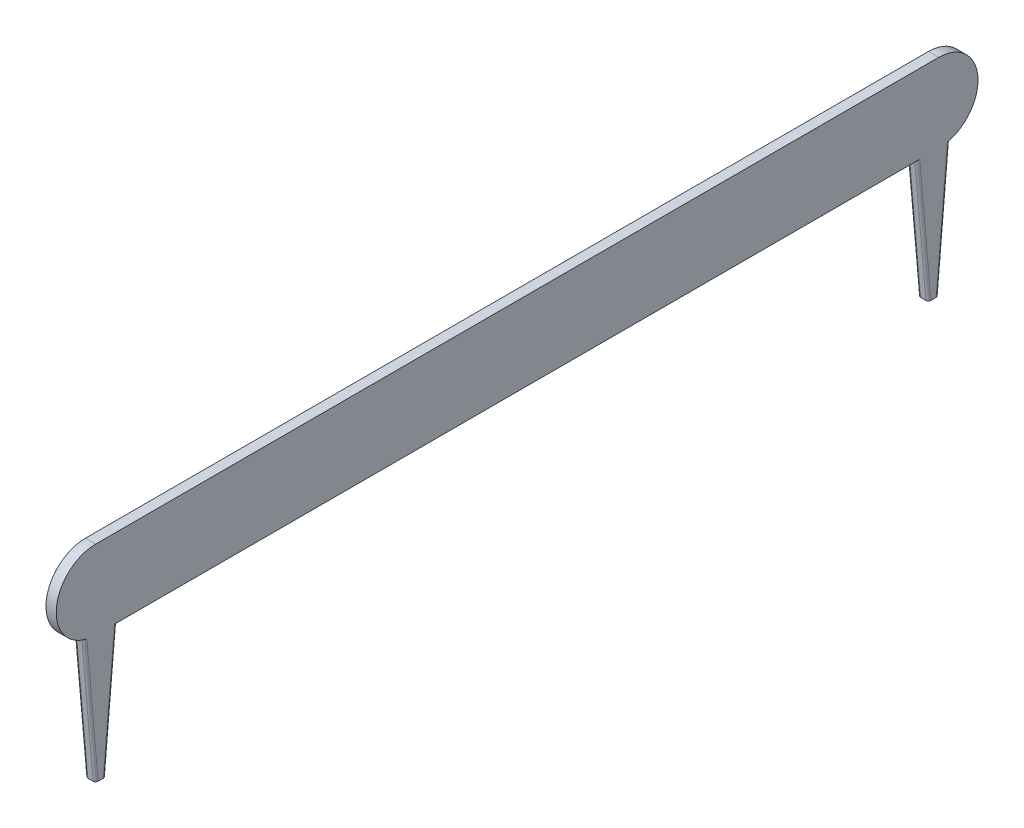
ISO-10303-21;
HEADER;
FILE_DESCRIPTION(('STEP AP214'),'2;1');
FILE_NAME('part.step','',(''),(''),'','','');
FILE_SCHEMA(('AUTOMOTIVE_DESIGN { 1 0 10303 214 1 1 1 1 }'));
ENDSEC;
DATA;
#1=APPLICATION_CONTEXT('core data for automotive mechanical design processes');
#2=APPLICATION_PROTOCOL_DEFINITION('international standard','automotive_design',2000,#1);
#3=PRODUCT_CONTEXT('',#1,'mechanical');
#4=PRODUCT('Part','Part','',(#3));
#5=PRODUCT_RELATED_PRODUCT_CATEGORY('part','',(#4));
#6=PRODUCT_DEFINITION_FORMATION('','',#4);
#7=PRODUCT_DEFINITION_CONTEXT('part definition',#1,'design');
#8=PRODUCT_DEFINITION('design','',#6,#7);
#9=PRODUCT_DEFINITION_SHAPE('','',#8);
#10=(LENGTH_UNIT() NAMED_UNIT(*) SI_UNIT(.MILLI.,.METRE.));
#11=(NAMED_UNIT(*) PLANE_ANGLE_UNIT() SI_UNIT($,.RADIAN.));
#12=(NAMED_UNIT(*) SI_UNIT($,.STERADIAN.) SOLID_ANGLE_UNIT());
#13=UNCERTAINTY_MEASURE_WITH_UNIT(LENGTH_MEASURE(1.E-05),#10,'distance_accuracy_value','');
#14=(GEOMETRIC_REPRESENTATION_CONTEXT(3) GLOBAL_UNCERTAINTY_ASSIGNED_CONTEXT((#13)) GLOBAL_UNIT_ASSIGNED_CONTEXT((#10,
#11,#12)) REPRESENTATION_CONTEXT('',''));
#15=CARTESIAN_POINT('',(0.,0.,0.));
#16=DIRECTION('',(0.,0.,1.));
#17=DIRECTION('',(1.,0.,0.));
#18=AXIS2_PLACEMENT_3D('',#15,#16,#17);
#19=CARTESIAN_POINT('',(20.,-50.000000000146,824.174999999995));
#20=DIRECTION('',(0.,1.,0.));
#21=DIRECTION('',(0.,0.,1.));
#22=AXIS2_PLACEMENT_3D('',#19,#20,#21);
#23=PLANE('',#22);
#24=DIRECTION('',(0.,0.,-1.));
#25=VECTOR('',#24,1.);
#26=CARTESIAN_POINT('',(0.,-50.000000000146,824.174999999995));
#27=LINE('',#26,#25);
#28=CARTESIAN_POINT('',(0.,-50.000000000146,787.32193330623));
#29=VERTEX_POINT('',#28);
#30=CARTESIAN_POINT('',(0.,-50.0000000001459,-787.321933306231));
#31=VERTEX_POINT('',#30);
#32=EDGE_CURVE('E203',#29,#31,#27,.T.);
#33=ORIENTED_EDGE('',*,*,#32,.T.);
#34=CARTESIAN_POINT('',(5.,-50.000000000146,-787.32193330623));
#35=DIRECTION('',(0.,1.,0.));
#36=DIRECTION('',(0.,0.,1.));
#37=AXIS2_PLACEMENT_3D('',#34,#35,#36);
#38=ELLIPSE('',#37,5.01909918771674,5.);
#39=CARTESIAN_POINT('',(5.,-50.0000000001459,-782.302834118514));
#40=VERTEX_POINT('',#39);
#41=EDGE_CURVE('E363',#31,#40,#38,.T.);
#42=ORIENTED_EDGE('',*,*,#41,.T.);
#43=DIRECTION('',(1.,0.,0.));
#44=VECTOR('',#43,1.);
#45=CARTESIAN_POINT('',(20.,-50.0000000001459,-782.302834118514));
#46=LINE('',#45,#44);
#47=CARTESIAN_POINT('',(15.,-50.0000000001459,-782.302834118514));
#48=VERTEX_POINT('',#47);
#49=EDGE_CURVE('E321',#40,#48,#46,.T.);
#50=ORIENTED_EDGE('',*,*,#49,.T.);
#51=CARTESIAN_POINT('',(15.,-50.0000000001459,-787.32193330623));
#52=DIRECTION('',(0.,1.,0.));
#53=DIRECTION('',(0.,0.,-1.));
#54=AXIS2_PLACEMENT_3D('',#51,#52,#53);
#55=ELLIPSE('',#54,5.01909918771674,5.);
#56=CARTESIAN_POINT('',(20.,-50.000000000146,-787.32193330623));
#57=VERTEX_POINT('',#56);
#58=EDGE_CURVE('E60',#48,#57,#55,.T.);
#59=ORIENTED_EDGE('',*,*,#58,.T.);
#60=DIRECTION('',(0.,0.,-1.));
#61=VECTOR('',#60,1.);
#62=CARTESIAN_POINT('',(20.,-50.000000000146,824.174999999995));
#63=LINE('',#62,#61);
#64=CARTESIAN_POINT('',(20.,-50.000000000146,787.321933306231));
#65=VERTEX_POINT('',#64);
#66=EDGE_CURVE('E67',#65,#57,#63,.T.);
#67=ORIENTED_EDGE('',*,*,#66,.F.);
#68=CARTESIAN_POINT('',(15.,-50.000000000146,787.321933306231));
#69=DIRECTION('',(0.,1.,0.));
#70=DIRECTION('',(0.,0.,1.));
#71=AXIS2_PLACEMENT_3D('',#68,#69,#70);
#72=ELLIPSE('',#71,5.01909918771674,5.);
#73=CARTESIAN_POINT('',(15.,-50.000000000146,782.302834118514));
#74=VERTEX_POINT('',#73);
#75=EDGE_CURVE('E284',#65,#74,#72,.T.);
#76=ORIENTED_EDGE('',*,*,#75,.T.);
#77=DIRECTION('',(-1.,0.,0.));
#78=VECTOR('',#77,1.);
#79=CARTESIAN_POINT('',(20.,-50.000000000146,782.302834118514));
#80=LINE('',#79,#78);
#81=CARTESIAN_POINT('',(5.,-50.000000000146,782.302834118514));
#82=VERTEX_POINT('',#81);
#83=EDGE_CURVE('E227',#82,#74,#80,.F.);
#84=ORIENTED_EDGE('',*,*,#83,.F.);
#85=CARTESIAN_POINT('',(5.,-50.0000000001459,787.32193330623));
#86=DIRECTION('',(0.,1.,0.));
#87=DIRECTION('',(0.,0.,-1.));
#88=AXIS2_PLACEMENT_3D('',#85,#86,#87);
#89=ELLIPSE('',#88,5.01909918771674,5.);
#90=EDGE_CURVE('E271',#82,#29,#89,.T.);
#91=ORIENTED_EDGE('',*,*,#90,.T.);
#92=EDGE_LOOP('',(#33,#42,#50,#59,#67,#76,#84,#91));
#93=FACE_BOUND('',#92,.T.);
#94=ADVANCED_FACE('F45',(#93),#23,.F.);
#95=CARTESIAN_POINT('',(20.,103.999999999854,824.174999999995));
#96=DIRECTION('',(0.,1.,0.));
#97=DIRECTION('',(0.,0.,1.));
#98=AXIS2_PLACEMENT_3D('',#95,#96,#97);
#99=PLANE('',#98);
#100=DIRECTION('',(0.,0.,-1.));
#101=VECTOR('',#100,1.);
#102=CARTESIAN_POINT('',(0.,103.999999999854,824.174999999995));
#103=LINE('',#102,#101);
#104=CARTESIAN_POINT('',(0.,103.999999999854,824.174999999995));
#105=VERTEX_POINT('',#104);
#106=CARTESIAN_POINT('',(0.,103.999999999854,-824.175000000005));
#107=VERTEX_POINT('',#106);
#108=EDGE_CURVE('E213',#105,#107,#103,.T.);
#109=ORIENTED_EDGE('',*,*,#108,.F.);
#110=DIRECTION('',(-1.,0.,0.));
#111=VECTOR('',#110,1.);
#112=CARTESIAN_POINT('',(20.,103.999999999854,824.174999999995));
#113=LINE('',#112,#111);
#114=CARTESIAN_POINT('',(20.,103.999999999854,824.174999999995));
#115=VERTEX_POINT('',#114);
#116=EDGE_CURVE('E196',#115,#105,#113,.T.);
#117=ORIENTED_EDGE('',*,*,#116,.F.);
#118=DIRECTION('',(0.,0.,-1.));
#119=VECTOR('',#118,1.);
#120=CARTESIAN_POINT('',(20.,103.999999999854,824.174999999995));
#121=LINE('',#120,#119);
#122=CARTESIAN_POINT('',(20.,103.999999999854,-824.175000000005));
#123=VERTEX_POINT('',#122);
#124=EDGE_CURVE('E189',#115,#123,#121,.T.);
#125=ORIENTED_EDGE('',*,*,#124,.T.);
#126=DIRECTION('',(-1.,0.,0.));
#127=VECTOR('',#126,1.);
#128=CARTESIAN_POINT('',(20.,103.999999999854,-824.175000000005));
#129=LINE('',#128,#127);
#130=EDGE_CURVE('E174',#123,#107,#129,.T.);
#131=ORIENTED_EDGE('',*,*,#130,.T.);
#132=EDGE_LOOP('',(#109,#117,#125,#131));
#133=FACE_BOUND('',#132,.T.);
#134=ADVANCED_FACE('F195',(#133),#99,.T.);
#135=CARTESIAN_POINT('',(20.,26.9999999998541,824.174999999995));
#136=DIRECTION('',(-1.,0.,0.));
#137=DIRECTION('',(0.,0.,1.));
#138=AXIS2_PLACEMENT_3D('',#135,#136,#137);
#139=CYLINDRICAL_SURFACE('',#138,77.);
#140=CARTESIAN_POINT('',(0.,26.9999999998541,824.174999999995));
#141=DIRECTION('',(1.,0.,0.));
#142=DIRECTION('',(0.,0.,-1.));
#143=AXIS2_PLACEMENT_3D('',#140,#141,#142);
#144=CIRCLE('',#143,77.);
#145=CARTESIAN_POINT('',(0.,-48.0954733114666,841.194691188402));
#146=VERTEX_POINT('',#145);
#147=EDGE_CURVE('E199',#105,#146,#144,.T.);
#148=ORIENTED_EDGE('',*,*,#147,.T.);
#149=CARTESIAN_POINT('',(0.,-48.0954733114666,841.194691188402));
#150=CARTESIAN_POINT('',(-1.0756041302022E-05,-48.0611743471263,841.346048623295));
#151=CARTESIAN_POINT('',(0.00655216893659473,-48.0264102694343,841.497293970125));
#152=CARTESIAN_POINT('',(0.0326687980328218,-47.9562273410992,841.798498559076));
#153=CARTESIAN_POINT('',(0.0522218452050827,-47.9208085236561,841.948457865847));
#154=CARTESIAN_POINT('',(0.104169423198406,-47.849578094612,842.246085545009));
#155=CARTESIAN_POINT('',(0.136567540828475,-47.8137663760168,842.393753265526));
#156=CARTESIAN_POINT('',(0.213977769658536,-47.7420608447139,842.685724601845));
#157=CARTESIAN_POINT('',(0.258989865638274,-47.7061670321053,842.830028221704));
#158=CARTESIAN_POINT('',(0.361367909285878,-47.6346060247687,843.114299846069));
#159=CARTESIAN_POINT('',(0.418737835787472,-47.5989389068459,843.254266437546));
#160=CARTESIAN_POINT('',(0.545512070701962,-47.5281721309134,843.528854091776));
#161=CARTESIAN_POINT('',(0.61492056077248,-47.4930726747309,843.663473277044));
#162=CARTESIAN_POINT('',(0.765333090830511,-47.423830121483,843.926252280626));
#163=CARTESIAN_POINT('',(0.84633215852923,-47.3896866217897,844.054414837082));
#164=CARTESIAN_POINT('',(1.01948488384663,-47.3227204899222,844.303334051452));
#165=CARTESIAN_POINT('',(1.11163801358328,-47.2898977953369,844.424091059436));
#166=CARTESIAN_POINT('',(1.30518134255607,-47.2264186430671,844.655551149587));
#167=CARTESIAN_POINT('',(1.4064222407999,-47.1957380897975,844.766372397933));
#168=CARTESIAN_POINT('',(1.61857935377832,-47.1364409159526,844.978852827846));
#169=CARTESIAN_POINT('',(1.7294916744686,-47.1078234730997,845.080515663688));
#170=CARTESIAN_POINT('',(1.96035213512079,-47.0530231382773,845.273811869412));
#171=CARTESIAN_POINT('',(2.08030256173989,-47.0268408661796,845.365442686695));
#172=CARTESIAN_POINT('',(2.32839090296458,-46.9773075080471,845.537724811226));
#173=CARTESIAN_POINT('',(2.45652812215923,-46.9539561820301,845.618377049211));
#174=CARTESIAN_POINT('',(2.71267289924444,-46.9116723165574,845.763656685858));
#175=CARTESIAN_POINT('',(2.84028657232852,-46.8925656427191,845.828928209321));
#176=CARTESIAN_POINT('',(3.1010667941804,-46.8574952132722,845.948246660142));
#177=CARTESIAN_POINT('',(3.23423280705899,-46.8415311551981,846.002294667752));
#178=CARTESIAN_POINT('',(3.50494311339463,-46.8130198417342,846.098517552931));
#179=CARTESIAN_POINT('',(3.64248131945715,-46.8004680497591,846.140708197335));
#180=CARTESIAN_POINT('',(3.92095490392878,-46.7789679663807,846.212815130403));
#181=CARTESIAN_POINT('',(4.06188871598681,-46.7700180459753,846.242736967941));
#182=CARTESIAN_POINT('',(4.33542013051403,-46.756401020168,846.288205489852));
#183=CARTESIAN_POINT('',(4.46785426201911,-46.7514639848726,846.304658846597));
#184=CARTESIAN_POINT('',(4.73352268583856,-46.7448733298681,846.326606708081));
#185=CARTESIAN_POINT('',(4.86675561594173,-46.7432151722388,846.332116358801));
#186=CARTESIAN_POINT('',(4.99999999999994,-46.7432238105524,846.332096877707));
#187=B_SPLINE_CURVE_WITH_KNOTS('',3,(#149,#150,#151,#152,#153,#154,#155,#156,#157,#158,#159,
#160,#161,#162,#163,#164,#165,#166,#167,#168,#169,#170,#171,#172,#173,#174,#175,#176,#177,#178,
#179,#180,#181,#182,#183,#184,#185,#186),.UNSPECIFIED.,.F.,.F.,(4,2,2,2,2,2,2,2,2,2,2,2,2,2,2,2,
2,2,4),(0.,0.465436593656988,0.930849650701879,1.3963927595666,1.86193530670109,
2.32762796857157,2.79348271635406,3.25913821105052,3.7247716765411,4.18381071608315,
4.6426657768212,5.10163732106685,5.56056993058109,5.99382467000894,6.42703768981399,
6.85967190735787,7.29211023890471,7.69225350460993,8.09184258903367),.UNSPECIFIED.);
#188=CARTESIAN_POINT('',(5.,-46.7432238105524,846.332096877706));
#189=VERTEX_POINT('',#188);
#190=EDGE_CURVE('E275',#146,#189,#187,.T.);
#191=ORIENTED_EDGE('',*,*,#190,.T.);
#192=DIRECTION('',(-1.,0.,0.));
#193=VECTOR('',#192,1.);
#194=CARTESIAN_POINT('',(20.,-46.7432238105524,846.332096877706));
#195=LINE('',#194,#193);
#196=CARTESIAN_POINT('',(15.,-46.7432238105524,846.332096877706));
#197=VERTEX_POINT('',#196);
#198=EDGE_CURVE('E222',#197,#189,#195,.T.);
#199=ORIENTED_EDGE('',*,*,#198,.F.);
#200=CARTESIAN_POINT('',(15.,-46.7432238105524,846.332096877706));
#201=CARTESIAN_POINT('',(15.1338113547472,-46.7432147624814,846.332117505062));
#202=CARTESIAN_POINT('',(15.2676159439783,-46.7448873458003,846.326560027269));
#203=CARTESIAN_POINT('',(15.5342019152263,-46.7515293443552,846.304441132196));
#204=CARTESIAN_POINT('',(15.6669835130527,-46.7564980438464,846.287882103878));
#205=CARTESIAN_POINT('',(15.9301973284445,-46.7696471415448,846.243974885278));
#206=CARTESIAN_POINT('',(16.0606351611499,-46.7778183502742,846.216657564426));
#207=CARTESIAN_POINT('',(16.3186238861102,-46.7972476725623,846.151519231688));
#208=CARTESIAN_POINT('',(16.4461747162228,-46.8085058524994,846.113697993937));
#209=CARTESIAN_POINT('',(16.6974522580934,-46.8339419707767,846.027940486965));
#210=CARTESIAN_POINT('',(16.8211811060821,-46.8481182428512,845.980009989869));
#211=CARTESIAN_POINT('',(17.064104276969,-46.8791969541396,845.874476500311));
#212=CARTESIAN_POINT('',(17.1832968970313,-46.8961004048629,845.816869918667));
#213=CARTESIAN_POINT('',(17.5329395715054,-46.950581262038,845.630263856145));
#214=CARTESIAN_POINT('',(17.7556041444308,-46.9919446323197,845.487426478406));
#215=CARTESIAN_POINT('',(18.181504666157,-47.0842072900702,845.164503204932));
#216=CARTESIAN_POINT('',(18.3838678718381,-47.1353740387436,844.983352564067));
#217=CARTESIAN_POINT('',(18.756583209928,-47.2440348990484,844.592258448844));
#218=CARTESIAN_POINT('',(18.9269251179892,-47.3015310223786,844.382305814946));
#219=CARTESIAN_POINT('',(19.2423763917093,-47.4245294899622,843.924660280195));
#220=CARTESIAN_POINT('',(19.3850954816589,-47.4903096349284,843.675394696149));
#221=CARTESIAN_POINT('',(19.6275879916706,-47.6240050330263,843.157343788749));
#222=CARTESIAN_POINT('',(19.7273604318781,-47.6919203348351,842.888558020193));
#223=CARTESIAN_POINT('',(19.8693273831796,-47.8166192403569,842.382962576777));
#224=CARTESIAN_POINT('',(19.9182324845338,-47.8734232095587,842.148029831534));
#225=CARTESIAN_POINT('',(19.9672311996457,-47.9576241379136,841.792306106516));
#226=CARTESIAN_POINT('',(19.9795042522397,-47.9855160301023,841.673210847365));
#227=CARTESIAN_POINT('',(19.9958889377178,-48.0408570864012,841.434340412809));
#228=CARTESIAN_POINT('',(19.9999994210988,-48.068306187615,841.314565144021));
#229=CARTESIAN_POINT('',(20.,-48.0954733114667,841.194691188401));
#230=B_SPLINE_CURVE_WITH_KNOTS('',3,(#200,#201,#202,#203,#204,#205,#206,#207,#208,#209,#210,
#211,#212,#213,#214,#215,#216,#217,#218,#219,#220,#221,#222,#223,#224,#225,#226,#227,#228,#229),
.UNSPECIFIED.,.F.,.F.,(4,2,2,2,2,2,2,2,2,2,2,2,2,2,4),(0.,0.401297766835564,0.802508421206037,
1.20257614799376,1.6026524780084,2.00250099022188,2.40249814845993,3.20202091172097,
4.02767240447049,4.85358708024819,5.7337160941303,6.61386518764025,7.35138154108277,
7.71993579220966,8.08854194173246),.UNSPECIFIED.);
#231=CARTESIAN_POINT('',(20.,-48.0954733114667,841.194691188401));
#232=VERTEX_POINT('',#231);
#233=EDGE_CURVE('E309',#197,#232,#230,.T.);
#234=ORIENTED_EDGE('',*,*,#233,.T.);
#235=CARTESIAN_POINT('',(20.,26.9999999998541,824.174999999995));
#236=DIRECTION('',(1.,0.,0.));
#237=DIRECTION('',(0.,0.,-1.));
#238=AXIS2_PLACEMENT_3D('',#235,#236,#237);
#239=CIRCLE('',#238,77.);
#240=EDGE_CURVE('E184',#115,#232,#239,.T.);
#241=ORIENTED_EDGE('',*,*,#240,.F.);
#242=ORIENTED_EDGE('',*,*,#116,.T.);
#243=EDGE_LOOP('',(#148,#191,#199,#234,#241,#242));
#244=FACE_BOUND('',#243,.T.);
#245=ADVANCED_FACE('F286',(#244),#139,.T.);
#246=CARTESIAN_POINT('',(20.,26.9999999998541,-824.175000000005));
#247=DIRECTION('',(-1.,0.,0.));
#248=DIRECTION('',(0.,0.,1.));
#249=AXIS2_PLACEMENT_3D('',#246,#247,#248);
#250=CYLINDRICAL_SURFACE('',#249,77.);
#251=CARTESIAN_POINT('',(0.,26.9999999998541,-824.175000000005));
#252=DIRECTION('',(-1.,0.,0.));
#253=DIRECTION('',(0.,0.,1.));
#254=AXIS2_PLACEMENT_3D('',#251,#252,#253);
#255=CIRCLE('',#254,77.);
#256=CARTESIAN_POINT('',(0.,-48.095473311469,-841.194691188401));
#257=VERTEX_POINT('',#256);
#258=EDGE_CURVE('E177',#107,#257,#255,.T.);
#259=ORIENTED_EDGE('',*,*,#258,.F.);
#260=ORIENTED_EDGE('',*,*,#130,.F.);
#261=CARTESIAN_POINT('',(20.,26.9999999998541,-824.175000000005));
#262=DIRECTION('',(-1.,0.,0.));
#263=DIRECTION('',(0.,0.,1.));
#264=AXIS2_PLACEMENT_3D('',#261,#262,#263);
#265=CIRCLE('',#264,77.);
#266=CARTESIAN_POINT('',(20.,-48.095473311469,-841.194691188401));
#267=VERTEX_POINT('',#266);
#268=EDGE_CURVE('E74',#123,#267,#265,.T.);
#269=ORIENTED_EDGE('',*,*,#268,.T.);
#270=CARTESIAN_POINT('',(20.,-48.095473311469,-841.194691188401));
#271=CARTESIAN_POINT('',(20.0000107560413,-48.0611743471287,-841.346048623294));
#272=CARTESIAN_POINT('',(19.9934478310634,-48.0264102694367,-841.497293970124));
#273=CARTESIAN_POINT('',(19.9673312019672,-47.9562273411017,-841.798498559075));
#274=CARTESIAN_POINT('',(19.9477781547949,-47.9208085236586,-841.948457865847));
#275=CARTESIAN_POINT('',(19.8958305768016,-47.8495780946146,-842.246085545008));
#276=CARTESIAN_POINT('',(19.8634324591716,-47.8137663760194,-842.393753265526));
#277=CARTESIAN_POINT('',(19.7860222303415,-47.7420608447166,-842.685724601844));
#278=CARTESIAN_POINT('',(19.7410101343618,-47.706167032108,-842.830028221704));
#279=CARTESIAN_POINT('',(19.6386320907142,-47.6346060247714,-843.114299846068));
#280=CARTESIAN_POINT('',(19.5812621642126,-47.5989389068486,-843.254266437546));
#281=CARTESIAN_POINT('',(19.4544879292981,-47.5281721309162,-843.528854091776));
#282=CARTESIAN_POINT('',(19.3850794392276,-47.4930726747337,-843.663473277044));
#283=CARTESIAN_POINT('',(19.2346669091696,-47.4238301214859,-843.926252280626));
#284=CARTESIAN_POINT('',(19.1536678414709,-47.3896866217926,-844.054414837082));
#285=CARTESIAN_POINT('',(18.9805151161535,-47.3227204899251,-844.303334051451));
#286=CARTESIAN_POINT('',(18.8883619864169,-47.2898977953398,-844.424091059436));
#287=CARTESIAN_POINT('',(18.6948186574441,-47.2264186430701,-844.655551149587));
#288=CARTESIAN_POINT('',(18.5935777592003,-47.1957380898004,-844.766372397932));
#289=CARTESIAN_POINT('',(18.3814206462219,-47.1364409159556,-844.978852827845));
#290=CARTESIAN_POINT('',(18.2705083255316,-47.1078234731027,-845.080515663687));
#291=CARTESIAN_POINT('',(18.0396478648795,-47.0530231382804,-845.273811869412));
#292=CARTESIAN_POINT('',(17.9196974382604,-47.0268408661827,-845.365442686694));
#293=CARTESIAN_POINT('',(17.6716090970357,-46.9773075080502,-845.537724811225));
#294=CARTESIAN_POINT('',(17.5434718778411,-46.9539561820332,-845.61837704921));
#295=CARTESIAN_POINT('',(17.2873271007559,-46.9116723165605,-845.763656685858));
#296=CARTESIAN_POINT('',(17.1597134276718,-46.8925656427223,-845.82892820932));
#297=CARTESIAN_POINT('',(16.89893320582,-46.8574952132754,-845.948246660142));
#298=CARTESIAN_POINT('',(16.7657671929414,-46.8415311552013,-846.002294667752));
#299=CARTESIAN_POINT('',(16.4950568866058,-46.8130198417374,-846.098517552931));
#300=CARTESIAN_POINT('',(16.3575186805432,-46.8004680497623,-846.140708197335));
#301=CARTESIAN_POINT('',(16.0790450960716,-46.7789679663839,-846.212815130403));
#302=CARTESIAN_POINT('',(15.9381112840136,-46.7700180459785,-846.24273696794));
#303=CARTESIAN_POINT('',(15.6645798694863,-46.7564010201712,-846.288205489851));
#304=CARTESIAN_POINT('',(15.5321457379811,-46.7514639848758,-846.304658846596));
#305=CARTESIAN_POINT('',(15.2664773141615,-46.7448733298713,-846.32660670808));
#306=CARTESIAN_POINT('',(15.1332443840583,-46.743215172242,-846.332116358801));
#307=CARTESIAN_POINT('',(15.,-46.7432238105556,-846.332096877706));
#308=B_SPLINE_CURVE_WITH_KNOTS('',3,(#270,#271,#272,#273,#274,#275,#276,#277,#278,#279,#280,
#281,#282,#283,#284,#285,#286,#287,#288,#289,#290,#291,#292,#293,#294,#295,#296,#297,#298,#299,
#300,#301,#302,#303,#304,#305,#306,#307),.UNSPECIFIED.,.F.,.F.,(4,2,2,2,2,2,2,2,2,2,2,2,2,2,2,2,
2,2,4),(0.,0.465436593656967,0.930849650701843,1.39639275956632,1.86193530670091,
2.32762796857148,2.79348271635395,3.25913821105027,3.72477167654082,4.18381071608285,
4.64266577682085,5.10163732106642,5.56056993058065,5.99382467000844,6.4270376898135,
6.85967190735734,7.29211023890424,7.69225350460968,8.09184258903365),.UNSPECIFIED.);
#309=CARTESIAN_POINT('',(15.,-46.7432238105556,-846.332096877706));
#310=VERTEX_POINT('',#309);
#311=EDGE_CURVE('E11',#267,#310,#308,.T.);
#312=ORIENTED_EDGE('',*,*,#311,.T.);
#313=DIRECTION('',(-1.,0.,0.));
#314=VECTOR('',#313,1.);
#315=CARTESIAN_POINT('',(20.,-46.7432238105556,-846.332096877706));
#316=LINE('',#315,#314);
#317=CARTESIAN_POINT('',(5.,-46.7432238105556,-846.332096877706));
#318=VERTEX_POINT('',#317);
#319=EDGE_CURVE('E183',#310,#318,#316,.T.);
#320=ORIENTED_EDGE('',*,*,#319,.T.);
#321=CARTESIAN_POINT('',(5.,-46.7432238105556,-846.332096877706));
#322=CARTESIAN_POINT('',(4.86618864525276,-46.7432147624845,-846.332117505062));
#323=CARTESIAN_POINT('',(4.73238405602169,-46.7448873458035,-846.326560027268));
#324=CARTESIAN_POINT('',(4.46579808477368,-46.7515293443584,-846.304441132195));
#325=CARTESIAN_POINT('',(4.3330164869473,-46.7564980438495,-846.287882103878));
#326=CARTESIAN_POINT('',(4.06980267155548,-46.7696471415479,-846.243974885278));
#327=CARTESIAN_POINT('',(3.93936483885012,-46.7778183502773,-846.216657564426));
#328=CARTESIAN_POINT('',(3.68137611388981,-46.7972476725655,-846.151519231687));
#329=CARTESIAN_POINT('',(3.55382528377717,-46.8085058525026,-846.113697993937));
#330=CARTESIAN_POINT('',(3.30254774190658,-46.8339419707798,-846.027940486965));
#331=CARTESIAN_POINT('',(3.17881889391784,-46.8481182428543,-845.980009989869));
#332=CARTESIAN_POINT('',(2.93589572303093,-46.8791969541427,-845.87447650031));
#333=CARTESIAN_POINT('',(2.81670310296863,-46.896100404866,-845.816869918666));
#334=CARTESIAN_POINT('',(2.46706042849457,-46.9505812620411,-845.630263856145));
#335=CARTESIAN_POINT('',(2.24439585556916,-46.9919446323228,-845.487426478406));
#336=CARTESIAN_POINT('',(1.8184953338429,-47.0842072900733,-845.164503204932));
#337=CARTESIAN_POINT('',(1.61613212816174,-47.1353740387466,-844.983352564067));
#338=CARTESIAN_POINT('',(1.24341679007186,-47.2440348990513,-844.592258448844));
#339=CARTESIAN_POINT('',(1.07307488201066,-47.3015310223815,-844.382305814945));
#340=CARTESIAN_POINT('',(0.757623608290607,-47.424529489965,-843.924660280194));
#341=CARTESIAN_POINT('',(0.614904518341038,-47.4903096349311,-843.675394696148));
#342=CARTESIAN_POINT('',(0.37241200832936,-47.624005033029,-843.157343788748));
#343=CARTESIAN_POINT('',(0.272639568121847,-47.6919203348378,-842.888558020193));
#344=CARTESIAN_POINT('',(0.130672616820395,-47.8166192403595,-842.382962576776));
#345=CARTESIAN_POINT('',(0.0817675154662013,-47.8734232095612,-842.148029831534));
#346=CARTESIAN_POINT('',(0.0327688003542464,-47.9576241379161,-841.792306106516));
#347=CARTESIAN_POINT('',(0.0204957477603062,-47.9855160301048,-841.673210847365));
#348=CARTESIAN_POINT('',(0.00411106228222072,-48.0408570864036,-841.434340412808));
#349=CARTESIAN_POINT('',(5.78901244743172E-07,-48.0683061876174,-841.314565144021));
#350=CARTESIAN_POINT('',(0.,-48.095473311469,-841.194691188401));
#351=B_SPLINE_CURVE_WITH_KNOTS('',3,(#321,#322,#323,#324,#325,#326,#327,#328,#329,#330,#331,
#332,#333,#334,#335,#336,#337,#338,#339,#340,#341,#342,#343,#344,#345,#346,#347,#348,#349,#350),
.UNSPECIFIED.,.F.,.F.,(4,2,2,2,2,2,2,2,2,2,2,2,2,2,4),(0.,0.401297766835549,0.80250842120606,
1.20257614799375,1.60265247800844,2.00250099022195,2.40249814846005,3.20202091172107,
4.02767240447062,4.85358708024835,5.73371609413032,6.61386518764036,7.3513815410825,
7.71993579220972,8.08854194173228),.UNSPECIFIED.);
#352=EDGE_CURVE('E366',#318,#257,#351,.T.);
#353=ORIENTED_EDGE('',*,*,#352,.T.);
#354=EDGE_LOOP('',(#259,#260,#269,#312,#320,#353));
#355=FACE_BOUND('',#354,.T.);
#356=ADVANCED_FACE('F175',(#355),#250,.T.);
#357=CARTESIAN_POINT('',(20.,26.9999999998541,-824.175000000005));
#358=DIRECTION('',(-1.,0.,0.));
#359=DIRECTION('',(0.,0.,1.));
#360=AXIS2_PLACEMENT_3D('',#357,#358,#359);
#361=PLANE('',#360);
#362=ORIENTED_EDGE('',*,*,#66,.T.);
#363=DIRECTION('',(0.,0.996194698091746,0.0871557427476584));
#364=VECTOR('',#363,1.);
#365=CARTESIAN_POINT('',(20.,-299.564221286408,-809.155973490454));
#366=LINE('',#365,#364);
#367=CARTESIAN_POINT('',(20.,-300.000000000146,-809.194099187712));
#368=VERTEX_POINT('',#367);
#369=EDGE_CURVE('E360',#57,#368,#366,.F.);
#370=ORIENTED_EDGE('',*,*,#369,.T.);
#371=DIRECTION('',(0.,0.,-1.));
#372=VECTOR('',#371,1.);
#373=CARTESIAN_POINT('',(20.,-300.000000000146,-824.174999999995));
#374=LINE('',#373,#372);
#375=CARTESIAN_POINT('',(20.,-300.000000000146,-819.155900812278));
#376=VERTEX_POINT('',#375);
#377=EDGE_CURVE('E420',#368,#376,#374,.T.);
#378=ORIENTED_EDGE('',*,*,#377,.T.);
#379=DIRECTION('',(0.,0.996194698091746,-0.0871557427476584));
#380=VECTOR('',#379,1.);
#381=CARTESIAN_POINT('',(20.,-46.3074450968173,-841.351123387248));
#382=LINE('',#381,#380);
#383=EDGE_CURVE('E192',#376,#267,#382,.T.);
#384=ORIENTED_EDGE('',*,*,#383,.T.);
#385=ORIENTED_EDGE('',*,*,#268,.F.);
#386=ORIENTED_EDGE('',*,*,#124,.F.);
#387=ORIENTED_EDGE('',*,*,#240,.T.);
#388=DIRECTION('',(0.,-0.996194698091746,-0.0871557427476584));
#389=VECTOR('',#388,1.);
#390=CARTESIAN_POINT('',(20.,-118.164640497554,835.064433396916));
#391=LINE('',#390,#389);
#392=CARTESIAN_POINT('',(20.,-300.000000000146,819.155900812278));
#393=VERTEX_POINT('',#392);
#394=EDGE_CURVE('E265',#232,#393,#391,.T.);
#395=ORIENTED_EDGE('',*,*,#394,.T.);
#396=DIRECTION('',(0.,0.,1.));
#397=VECTOR('',#396,1.);
#398=CARTESIAN_POINT('',(20.,-300.000000000146,824.174999999995));
#399=LINE('',#398,#397);
#400=CARTESIAN_POINT('',(20.,-300.000000000146,809.194099187712));
#401=VERTEX_POINT('',#400);
#402=EDGE_CURVE('E434',#401,#393,#399,.T.);
#403=ORIENTED_EDGE('',*,*,#402,.F.);
#404=DIRECTION('',(0.,-0.996194698091746,0.0871557427476584));
#405=VECTOR('',#404,1.);
#406=CARTESIAN_POINT('',(20.,166.331851383062,768.395348750625));
#407=LINE('',#406,#405);
#408=EDGE_CURVE('E268',#401,#65,#407,.F.);
#409=ORIENTED_EDGE('',*,*,#408,.T.);
#410=EDGE_LOOP('',(#362,#370,#378,#384,#385,#386,#387,#395,#403,#409));
#411=FACE_BOUND('',#410,.T.);
#412=ADVANCED_FACE('F188',(#411),#361,.F.);
#413=CARTESIAN_POINT('',(0.,26.9999999998541,-824.175000000005));
#414=DIRECTION('',(-1.,0.,0.));
#415=DIRECTION('',(0.,0.,1.));
#416=AXIS2_PLACEMENT_3D('',#413,#414,#415);
#417=PLANE('',#416);
#418=DIRECTION('',(0.,0.,1.));
#419=VECTOR('',#418,1.);
#420=CARTESIAN_POINT('',(0.,-300.000000000146,-824.174999999995));
#421=LINE('',#420,#419);
#422=CARTESIAN_POINT('',(0.,-300.000000000146,-819.155900812278));
#423=VERTEX_POINT('',#422);
#424=CARTESIAN_POINT('',(0.,-300.000000000146,-809.194099187711));
#425=VERTEX_POINT('',#424);
#426=EDGE_CURVE('E325',#423,#425,#421,.T.);
#427=ORIENTED_EDGE('',*,*,#426,.T.);
#428=DIRECTION('',(0.,0.996194698091746,0.0871557427476584));
#429=VECTOR('',#428,1.);
#430=CARTESIAN_POINT('',(0.,23.2153645544181,-780.916418911788));
#431=LINE('',#430,#429);
#432=EDGE_CURVE('E328',#425,#31,#431,.T.);
#433=ORIENTED_EDGE('',*,*,#432,.T.);
#434=ORIENTED_EDGE('',*,*,#32,.F.);
#435=DIRECTION('',(0.,-0.996194698091746,0.0871557427476584));
#436=VECTOR('',#435,1.);
#437=CARTESIAN_POINT('',(0.,-299.564221286408,809.155973490454));
#438=LINE('',#437,#436);
#439=CARTESIAN_POINT('',(0.,-300.000000000146,809.194099187712));
#440=VERTEX_POINT('',#439);
#441=EDGE_CURVE('E243',#29,#440,#438,.T.);
#442=ORIENTED_EDGE('',*,*,#441,.T.);
#443=DIRECTION('',(0.,0.,-1.));
#444=VECTOR('',#443,1.);
#445=CARTESIAN_POINT('',(0.,-300.000000000146,824.174999999995));
#446=LINE('',#445,#444);
#447=CARTESIAN_POINT('',(0.,-300.000000000146,819.155900812278));
#448=VERTEX_POINT('',#447);
#449=EDGE_CURVE('E231',#448,#440,#446,.T.);
#450=ORIENTED_EDGE('',*,*,#449,.F.);
#451=DIRECTION('',(0.,-0.996194698091746,-0.0871557427476584));
#452=VECTOR('',#451,1.);
#453=CARTESIAN_POINT('',(0.,-46.3074450968142,841.351123387248));
#454=LINE('',#453,#452);
#455=EDGE_CURVE('E239',#448,#146,#454,.F.);
#456=ORIENTED_EDGE('',*,*,#455,.T.);
#457=ORIENTED_EDGE('',*,*,#147,.F.);
#458=ORIENTED_EDGE('',*,*,#108,.T.);
#459=ORIENTED_EDGE('',*,*,#258,.T.);
#460=DIRECTION('',(0.,0.996194698091746,-0.0871557427476584));
#461=VECTOR('',#460,1.);
#462=CARTESIAN_POINT('',(0.,24.9518463310892,-847.585503558079));
#463=LINE('',#462,#461);
#464=EDGE_CURVE('E317',#257,#423,#463,.F.);
#465=ORIENTED_EDGE('',*,*,#464,.T.);
#466=EDGE_LOOP('',(#427,#433,#434,#442,#450,#456,#457,#458,#459,#465));
#467=FACE_BOUND('',#466,.T.);
#468=ADVANCED_FACE('F388',(#467),#417,.T.);
#469=CARTESIAN_POINT('',(0.,-300.000000000146,804.174999999995));
#470=DIRECTION('',(0.,-0.0871557427476584,-0.996194698091746));
#471=DIRECTION('',(0.,0.996194698091746,-0.0871557427476584));
#472=AXIS2_PLACEMENT_3D('',#469,#470,#471);
#473=PLANE('',#472);
#474=DIRECTION('',(1.,0.,0.));
#475=VECTOR('',#474,1.);
#476=CARTESIAN_POINT('',(0.,-300.000000000146,804.174999999995));
#477=LINE('',#476,#475);
#478=CARTESIAN_POINT('',(5.,-300.000000000146,804.174999999995));
#479=VERTEX_POINT('',#478);
#480=CARTESIAN_POINT('',(15.,-300.000000000146,804.174999999995));
#481=VERTEX_POINT('',#480);
#482=EDGE_CURVE('E431',#479,#481,#477,.T.);
#483=ORIENTED_EDGE('',*,*,#482,.F.);
#484=DIRECTION('',(0.,0.996194698091746,-0.0871557427476584));
#485=VECTOR('',#484,1.);
#486=CARTESIAN_POINT('',(5.,-50.0000000001459,782.302834118514));
#487=LINE('',#486,#485);
#488=EDGE_CURVE('E235',#479,#82,#487,.T.);
#489=ORIENTED_EDGE('',*,*,#488,.T.);
#490=ORIENTED_EDGE('',*,*,#83,.T.);
#491=DIRECTION('',(0.,0.996194698091746,-0.0871557427476584));
#492=VECTOR('',#491,1.);
#493=CARTESIAN_POINT('',(15.,-300.000000000146,804.174999999995));
#494=LINE('',#493,#492);
#495=EDGE_CURVE('E221',#74,#481,#494,.F.);
#496=ORIENTED_EDGE('',*,*,#495,.T.);
#497=EDGE_LOOP('',(#483,#489,#490,#496));
#498=FACE_BOUND('',#497,.T.);
#499=ADVANCED_FACE('F385',(#498),#473,.T.);
#500=CARTESIAN_POINT('',(0.,-300.000000000146,824.174999999995));
#501=DIRECTION('',(0.,-0.0871557427476584,0.996194698091746));
#502=DIRECTION('',(0.,-0.996194698091746,-0.0871557427476584));
#503=AXIS2_PLACEMENT_3D('',#500,#501,#502);
#504=PLANE('',#503);
#505=ORIENTED_EDGE('',*,*,#198,.T.);
#506=DIRECTION('',(0.,0.996194698091746,0.0871557427476584));
#507=VECTOR('',#506,1.);
#508=CARTESIAN_POINT('',(5.,-300.000000000146,824.174999999995));
#509=LINE('',#508,#507);
#510=CARTESIAN_POINT('',(5.,-300.000000000146,824.174999999995));
#511=VERTEX_POINT('',#510);
#512=EDGE_CURVE('E262',#189,#511,#509,.F.);
#513=ORIENTED_EDGE('',*,*,#512,.T.);
#514=DIRECTION('',(-1.,0.,0.));
#515=VECTOR('',#514,1.);
#516=CARTESIAN_POINT('',(0.,-300.000000000146,824.174999999995));
#517=LINE('',#516,#515);
#518=CARTESIAN_POINT('',(15.,-300.000000000146,824.174999999995));
#519=VERTEX_POINT('',#518);
#520=EDGE_CURVE('E206',#519,#511,#517,.T.);
#521=ORIENTED_EDGE('',*,*,#520,.F.);
#522=DIRECTION('',(0.,0.996194698091746,0.0871557427476584));
#523=VECTOR('',#522,1.);
#524=CARTESIAN_POINT('',(15.,-300.000000000146,824.174999999995));
#525=LINE('',#524,#523);
#526=EDGE_CURVE('E258',#519,#197,#525,.T.);
#527=ORIENTED_EDGE('',*,*,#526,.T.);
#528=EDGE_LOOP('',(#505,#513,#521,#527));
#529=FACE_BOUND('',#528,.T.);
#530=ADVANCED_FACE('F382',(#529),#504,.T.);
#531=CARTESIAN_POINT('',(0.,-300.000000000146,0.));
#532=DIRECTION('',(0.,-1.,0.));
#533=DIRECTION('',(0.,0.,-1.));
#534=AXIS2_PLACEMENT_3D('',#531,#532,#533);
#535=PLANE('',#534);
#536=ORIENTED_EDGE('',*,*,#449,.T.);
#537=CARTESIAN_POINT('',(5.,-300.000000000146,809.194099187712));
#538=DIRECTION('',(0.,-1.,0.));
#539=DIRECTION('',(0.,0.,-1.));
#540=AXIS2_PLACEMENT_3D('',#537,#538,#539);
#541=ELLIPSE('',#540,5.01909918771674,5.);
#542=EDGE_CURVE('E255',#440,#479,#541,.T.);
#543=ORIENTED_EDGE('',*,*,#542,.T.);
#544=ORIENTED_EDGE('',*,*,#482,.T.);
#545=CARTESIAN_POINT('',(15.,-300.000000000146,809.194099187712));
#546=DIRECTION('',(0.,-1.,0.));
#547=DIRECTION('',(0.,0.,1.));
#548=AXIS2_PLACEMENT_3D('',#545,#546,#547);
#549=ELLIPSE('',#548,5.01909918771674,5.);
#550=EDGE_CURVE('E249',#481,#401,#549,.T.);
#551=ORIENTED_EDGE('',*,*,#550,.T.);
#552=ORIENTED_EDGE('',*,*,#402,.T.);
#553=CARTESIAN_POINT('',(15.,-300.000000000146,819.155900812278));
#554=DIRECTION('',(0.,-1.,0.));
#555=DIRECTION('',(0.,0.,-1.));
#556=AXIS2_PLACEMENT_3D('',#553,#554,#555);
#557=ELLIPSE('',#556,5.01909918771674,5.);
#558=EDGE_CURVE('E246',#393,#519,#557,.T.);
#559=ORIENTED_EDGE('',*,*,#558,.T.);
#560=ORIENTED_EDGE('',*,*,#520,.T.);
#561=CARTESIAN_POINT('',(5.,-300.000000000146,819.155900812278));
#562=DIRECTION('',(0.,-1.,0.));
#563=DIRECTION('',(0.,0.,1.));
#564=AXIS2_PLACEMENT_3D('',#561,#562,#563);
#565=ELLIPSE('',#564,5.01909918771674,5.);
#566=EDGE_CURVE('E252',#511,#448,#565,.T.);
#567=ORIENTED_EDGE('',*,*,#566,.T.);
#568=EDGE_LOOP('',(#536,#543,#544,#551,#552,#559,#560,#567));
#569=FACE_BOUND('',#568,.T.);
#570=ADVANCED_FACE('F384',(#569),#535,.T.);
#571=CARTESIAN_POINT('',(5.,-299.564221286408,809.155973490454));
#572=DIRECTION('',(0.,0.996194698091746,-0.0871557427476584));
#573=DIRECTION('',(0.,0.0871557427476584,0.996194698091746));
#574=AXIS2_PLACEMENT_3D('',#571,#572,#573);
#575=CYLINDRICAL_SURFACE('',#574,5.);
#576=ORIENTED_EDGE('',*,*,#542,.F.);
#577=ORIENTED_EDGE('',*,*,#441,.F.);
#578=ORIENTED_EDGE('',*,*,#90,.F.);
#579=ORIENTED_EDGE('',*,*,#488,.F.);
#580=EDGE_LOOP('',(#576,#577,#578,#579));
#581=FACE_BOUND('',#580,.T.);
#582=ADVANCED_FACE('F296',(#581),#575,.T.);
#583=CARTESIAN_POINT('',(5.,-118.164640497554,835.064433396916));
#584=DIRECTION('',(0.,0.996194698091746,0.0871557427476584));
#585=DIRECTION('',(0.,-0.0871557427476584,0.996194698091746));
#586=AXIS2_PLACEMENT_3D('',#583,#584,#585);
#587=CYLINDRICAL_SURFACE('',#586,5.);
#588=ORIENTED_EDGE('',*,*,#566,.F.);
#589=ORIENTED_EDGE('',*,*,#512,.F.);
#590=ORIENTED_EDGE('',*,*,#190,.F.);
#591=ORIENTED_EDGE('',*,*,#455,.F.);
#592=EDGE_LOOP('',(#588,#589,#590,#591));
#593=FACE_BOUND('',#592,.T.);
#594=ADVANCED_FACE('F290',(#593),#587,.T.);
#595=CARTESIAN_POINT('',(15.,166.331851383062,768.395348750625));
#596=DIRECTION('',(0.,-0.996194698091746,0.0871557427476584));
#597=DIRECTION('',(0.,-0.0871557427476584,-0.996194698091746));
#598=AXIS2_PLACEMENT_3D('',#595,#596,#597);
#599=CYLINDRICAL_SURFACE('',#598,5.);
#600=ORIENTED_EDGE('',*,*,#550,.F.);
#601=ORIENTED_EDGE('',*,*,#495,.F.);
#602=ORIENTED_EDGE('',*,*,#75,.F.);
#603=ORIENTED_EDGE('',*,*,#408,.F.);
#604=EDGE_LOOP('',(#600,#601,#602,#603));
#605=FACE_BOUND('',#604,.T.);
#606=ADVANCED_FACE('F295',(#605),#599,.T.);
#607=CARTESIAN_POINT('',(15.,-299.564221286408,819.194026509536));
#608=DIRECTION('',(0.,-0.996194698091746,-0.0871557427476584));
#609=DIRECTION('',(0.,0.0871557427476584,-0.996194698091746));
#610=AXIS2_PLACEMENT_3D('',#607,#608,#609);
#611=CYLINDRICAL_SURFACE('',#610,5.);
#612=ORIENTED_EDGE('',*,*,#558,.F.);
#613=ORIENTED_EDGE('',*,*,#394,.F.);
#614=ORIENTED_EDGE('',*,*,#233,.F.);
#615=ORIENTED_EDGE('',*,*,#526,.F.);
#616=EDGE_LOOP('',(#612,#613,#614,#615));
#617=FACE_BOUND('',#616,.T.);
#618=ADVANCED_FACE('F301',(#617),#611,.T.);
#619=CARTESIAN_POINT('',(0.,-300.000000000146,-824.174999999995));
#620=DIRECTION('',(0.,-0.0871557427476584,-0.996194698091746));
#621=DIRECTION('',(0.,0.996194698091746,-0.0871557427476584));
#622=AXIS2_PLACEMENT_3D('',#619,#620,#621);
#623=PLANE('',#622);
#624=DIRECTION('',(-1.,0.,0.));
#625=VECTOR('',#624,1.);
#626=CARTESIAN_POINT('',(0.,-300.000000000146,-824.174999999995));
#627=LINE('',#626,#625);
#628=CARTESIAN_POINT('',(15.,-300.000000000146,-824.174999999995));
#629=VERTEX_POINT('',#628);
#630=CARTESIAN_POINT('',(5.,-300.000000000146,-824.174999999995));
#631=VERTEX_POINT('',#630);
#632=EDGE_CURVE('E415',#629,#631,#627,.T.);
#633=ORIENTED_EDGE('',*,*,#632,.T.);
#634=DIRECTION('',(0.,0.996194698091746,-0.0871557427476584));
#635=VECTOR('',#634,1.);
#636=CARTESIAN_POINT('',(5.,-300.000000000146,-824.174999999995));
#637=LINE('',#636,#635);
#638=EDGE_CURVE('E354',#631,#318,#637,.T.);
#639=ORIENTED_EDGE('',*,*,#638,.T.);
#640=ORIENTED_EDGE('',*,*,#319,.F.);
#641=DIRECTION('',(0.,0.996194698091746,-0.0871557427476584));
#642=VECTOR('',#641,1.);
#643=CARTESIAN_POINT('',(15.,-300.000000000146,-824.174999999995));
#644=LINE('',#643,#642);
#645=EDGE_CURVE('E351',#310,#629,#644,.F.);
#646=ORIENTED_EDGE('',*,*,#645,.T.);
#647=EDGE_LOOP('',(#633,#639,#640,#646));
#648=FACE_BOUND('',#647,.T.);
#649=ADVANCED_FACE('F306',(#648),#623,.T.);
#650=CARTESIAN_POINT('',(0.,-300.000000000146,-804.174999999995));
#651=DIRECTION('',(0.,-0.0871557427476584,0.996194698091746));
#652=DIRECTION('',(0.,-0.996194698091746,-0.0871557427476584));
#653=AXIS2_PLACEMENT_3D('',#650,#651,#652);
#654=PLANE('',#653);
#655=ORIENTED_EDGE('',*,*,#49,.F.);
#656=DIRECTION('',(0.,0.996194698091746,0.0871557427476584));
#657=VECTOR('',#656,1.);
#658=CARTESIAN_POINT('',(5.,-300.000000000146,-804.174999999995));
#659=LINE('',#658,#657);
#660=CARTESIAN_POINT('',(5.,-300.000000000146,-804.174999999995));
#661=VERTEX_POINT('',#660);
#662=EDGE_CURVE('E336',#40,#661,#659,.F.);
#663=ORIENTED_EDGE('',*,*,#662,.T.);
#664=DIRECTION('',(1.,0.,0.));
#665=VECTOR('',#664,1.);
#666=CARTESIAN_POINT('',(0.,-300.000000000146,-804.174999999995));
#667=LINE('',#666,#665);
#668=CARTESIAN_POINT('',(15.,-300.000000000146,-804.174999999995));
#669=VERTEX_POINT('',#668);
#670=EDGE_CURVE('E232',#661,#669,#667,.T.);
#671=ORIENTED_EDGE('',*,*,#670,.T.);
#672=DIRECTION('',(0.,0.996194698091746,0.0871557427476584));
#673=VECTOR('',#672,1.);
#674=CARTESIAN_POINT('',(15.,-50.0000000001459,-782.302834118514));
#675=LINE('',#674,#673);
#676=EDGE_CURVE('E332',#669,#48,#675,.T.);
#677=ORIENTED_EDGE('',*,*,#676,.T.);
#678=EDGE_LOOP('',(#655,#663,#671,#677));
#679=FACE_BOUND('',#678,.T.);
#680=ADVANCED_FACE('F523',(#679),#654,.T.);
#681=CARTESIAN_POINT('',(0.,-300.000000000146,0.));
#682=DIRECTION('',(0.,-1.,0.));
#683=DIRECTION('',(0.,0.,1.));
#684=AXIS2_PLACEMENT_3D('',#681,#682,#683);
#685=PLANE('',#684);
#686=ORIENTED_EDGE('',*,*,#670,.F.);
#687=CARTESIAN_POINT('',(5.,-300.000000000146,-809.194099187711));
#688=DIRECTION('',(0.,-1.,0.));
#689=DIRECTION('',(0.,0.,1.));
#690=AXIS2_PLACEMENT_3D('',#687,#688,#689);
#691=ELLIPSE('',#690,5.01909918771674,5.);
#692=EDGE_CURVE('E348',#661,#425,#691,.T.);
#693=ORIENTED_EDGE('',*,*,#692,.T.);
#694=ORIENTED_EDGE('',*,*,#426,.F.);
#695=CARTESIAN_POINT('',(5.,-300.000000000146,-819.155900812278));
#696=DIRECTION('',(0.,-1.,0.));
#697=DIRECTION('',(0.,0.,-1.));
#698=AXIS2_PLACEMENT_3D('',#695,#696,#697);
#699=ELLIPSE('',#698,5.01909918771674,5.);
#700=EDGE_CURVE('E345',#423,#631,#699,.T.);
#701=ORIENTED_EDGE('',*,*,#700,.T.);
#702=ORIENTED_EDGE('',*,*,#632,.F.);
#703=CARTESIAN_POINT('',(15.,-300.000000000146,-819.155900812278));
#704=DIRECTION('',(0.,-1.,0.));
#705=DIRECTION('',(0.,0.,1.));
#706=AXIS2_PLACEMENT_3D('',#703,#704,#705);
#707=ELLIPSE('',#706,5.01909918771674,5.);
#708=EDGE_CURVE('E339',#629,#376,#707,.T.);
#709=ORIENTED_EDGE('',*,*,#708,.T.);
#710=ORIENTED_EDGE('',*,*,#377,.F.);
#711=CARTESIAN_POINT('',(15.,-300.000000000146,-809.194099187712));
#712=DIRECTION('',(0.,-1.,0.));
#713=DIRECTION('',(0.,0.,-1.));
#714=AXIS2_PLACEMENT_3D('',#711,#712,#713);
#715=ELLIPSE('',#714,5.01909918771674,5.);
#716=EDGE_CURVE('E342',#368,#669,#715,.T.);
#717=ORIENTED_EDGE('',*,*,#716,.T.);
#718=EDGE_LOOP('',(#686,#693,#694,#701,#702,#709,#710,#717));
#719=FACE_BOUND('',#718,.T.);
#720=ADVANCED_FACE('F506',(#719),#685,.T.);
#721=CARTESIAN_POINT('',(5.,23.2153645544182,-780.916418911788));
#722=DIRECTION('',(0.,0.996194698091746,0.0871557427476584));
#723=DIRECTION('',(0.,-0.0871557427476584,0.996194698091746));
#724=AXIS2_PLACEMENT_3D('',#721,#722,#723);
#725=CYLINDRICAL_SURFACE('',#724,5.);
#726=ORIENTED_EDGE('',*,*,#692,.F.);
#727=ORIENTED_EDGE('',*,*,#662,.F.);
#728=ORIENTED_EDGE('',*,*,#41,.F.);
#729=ORIENTED_EDGE('',*,*,#432,.F.);
#730=EDGE_LOOP('',(#726,#727,#728,#729));
#731=FACE_BOUND('',#730,.T.);
#732=ADVANCED_FACE('F408',(#731),#725,.T.);
#733=CARTESIAN_POINT('',(5.,-299.564221286408,-819.194026509536));
#734=DIRECTION('',(0.,0.996194698091746,-0.0871557427476584));
#735=DIRECTION('',(0.,0.0871557427476584,0.996194698091746));
#736=AXIS2_PLACEMENT_3D('',#733,#734,#735);
#737=CYLINDRICAL_SURFACE('',#736,5.);
#738=ORIENTED_EDGE('',*,*,#700,.F.);
#739=ORIENTED_EDGE('',*,*,#464,.F.);
#740=ORIENTED_EDGE('',*,*,#352,.F.);
#741=ORIENTED_EDGE('',*,*,#638,.F.);
#742=EDGE_LOOP('',(#738,#739,#740,#741));
#743=FACE_BOUND('',#742,.T.);
#744=ADVANCED_FACE('F373',(#743),#737,.T.);
#745=CARTESIAN_POINT('',(15.,-299.564221286408,-809.155973490454));
#746=DIRECTION('',(0.,-0.996194698091746,-0.0871557427476584));
#747=DIRECTION('',(0.,0.0871557427476584,-0.996194698091746));
#748=AXIS2_PLACEMENT_3D('',#745,#746,#747);
#749=CYLINDRICAL_SURFACE('',#748,5.);
#750=ORIENTED_EDGE('',*,*,#716,.F.);
#751=ORIENTED_EDGE('',*,*,#369,.F.);
#752=ORIENTED_EDGE('',*,*,#58,.F.);
#753=ORIENTED_EDGE('',*,*,#676,.F.);
#754=EDGE_LOOP('',(#750,#751,#752,#753));
#755=FACE_BOUND('',#754,.T.);
#756=ADVANCED_FACE('F503',(#755),#749,.T.);
#757=CARTESIAN_POINT('',(15.,24.9518463310892,-847.585503558079));
#758=DIRECTION('',(0.,-0.996194698091746,0.0871557427476584));
#759=DIRECTION('',(0.,-0.0871557427476584,-0.996194698091746));
#760=AXIS2_PLACEMENT_3D('',#757,#758,#759);
#761=CYLINDRICAL_SURFACE('',#760,5.);
#762=ORIENTED_EDGE('',*,*,#708,.F.);
#763=ORIENTED_EDGE('',*,*,#645,.F.);
#764=ORIENTED_EDGE('',*,*,#311,.F.);
#765=ORIENTED_EDGE('',*,*,#383,.F.);
#766=EDGE_LOOP('',(#762,#763,#764,#765));
#767=FACE_BOUND('',#766,.T.);
#768=ADVANCED_FACE('F47',(#767),#761,.T.);
#769=CLOSED_SHELL('',(#94,#134,#245,#356,#412,#468,#499,#530,#570,#582,#594,#606,#618,#649,#680,
#720,#732,#744,#756,#768));
#770=MANIFOLD_SOLID_BREP('B2',#769);
#771=ADVANCED_BREP_SHAPE_REPRESENTATION('',(#18,#770),#14);
#772=SHAPE_DEFINITION_REPRESENTATION(#9,#771);
ENDSEC;
END-ISO-10303-21;
